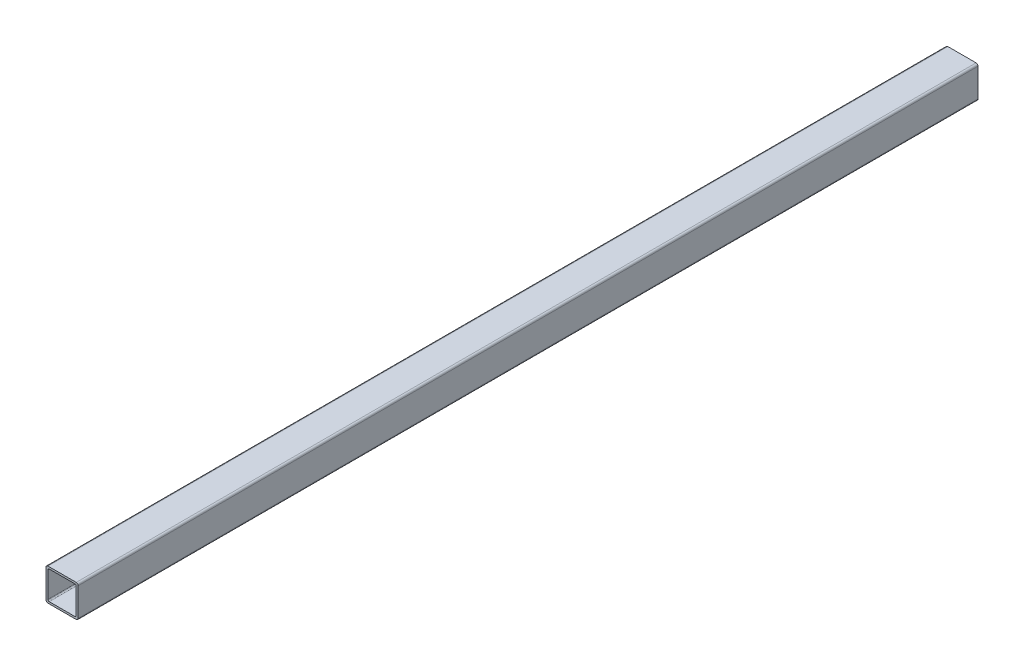
ISO-10303-21;
HEADER;
FILE_DESCRIPTION(('STEP AP214'),'2;1');
FILE_NAME('part.step','',(''),(''),'','','');
FILE_SCHEMA(('AUTOMOTIVE_DESIGN { 1 0 10303 214 1 1 1 1 }'));
ENDSEC;
DATA;
#1=APPLICATION_CONTEXT('core data for automotive mechanical design processes');
#2=APPLICATION_PROTOCOL_DEFINITION('international standard','automotive_design',2000,#1);
#3=PRODUCT_CONTEXT('',#1,'mechanical');
#4=PRODUCT('Part','Part','',(#3));
#5=PRODUCT_RELATED_PRODUCT_CATEGORY('part','',(#4));
#6=PRODUCT_DEFINITION_FORMATION('','',#4);
#7=PRODUCT_DEFINITION_CONTEXT('part definition',#1,'design');
#8=PRODUCT_DEFINITION('design','',#6,#7);
#9=PRODUCT_DEFINITION_SHAPE('','',#8);
#10=(LENGTH_UNIT() NAMED_UNIT(*) SI_UNIT(.MILLI.,.METRE.));
#11=(NAMED_UNIT(*) PLANE_ANGLE_UNIT() SI_UNIT($,.RADIAN.));
#12=(NAMED_UNIT(*) SI_UNIT($,.STERADIAN.) SOLID_ANGLE_UNIT());
#13=UNCERTAINTY_MEASURE_WITH_UNIT(LENGTH_MEASURE(1.E-05),#10,'distance_accuracy_value','');
#14=(GEOMETRIC_REPRESENTATION_CONTEXT(3) GLOBAL_UNCERTAINTY_ASSIGNED_CONTEXT((#13)) GLOBAL_UNIT_ASSIGNED_CONTEXT((#10,
#11,#12)) REPRESENTATION_CONTEXT('',''));
#15=CARTESIAN_POINT('',(0.,0.,0.));
#16=DIRECTION('',(0.,0.,1.));
#17=DIRECTION('',(1.,0.,0.));
#18=AXIS2_PLACEMENT_3D('',#15,#16,#17);
#19=CARTESIAN_POINT('',(0.,94.,2941.42135623731));
#20=DIRECTION('',(1.,0.,0.));
#21=DIRECTION('',(0.,0.,-1.));
#22=AXIS2_PLACEMENT_3D('',#19,#20,#21);
#23=PLANE('',#22);
#24=DIRECTION('',(0.,-1.,0.));
#25=VECTOR('',#24,1.);
#26=CARTESIAN_POINT('',(0.,94.,2800.));
#27=LINE('',#26,#25);
#28=CARTESIAN_POINT('',(0.,94.,2800.));
#29=VERTEX_POINT('',#28);
#30=CARTESIAN_POINT('',(0.,6.00000000000006,2800.));
#31=VERTEX_POINT('',#30);
#32=EDGE_CURVE('E306',#29,#31,#27,.T.);
#33=ORIENTED_EDGE('',*,*,#32,.F.);
#34=DIRECTION('',(0.,0.,-1.));
#35=VECTOR('',#34,1.);
#36=CARTESIAN_POINT('',(0.,94.,2941.42135623731));
#37=LINE('',#36,#35);
#38=CARTESIAN_POINT('',(0.,94.,0.));
#39=VERTEX_POINT('',#38);
#40=EDGE_CURVE('E50',#29,#39,#37,.T.);
#41=ORIENTED_EDGE('',*,*,#40,.T.);
#42=DIRECTION('',(0.,-1.,0.));
#43=VECTOR('',#42,1.);
#44=CARTESIAN_POINT('',(0.,94.,0.));
#45=LINE('',#44,#43);
#46=CARTESIAN_POINT('',(0.,6.00000000000006,0.));
#47=VERTEX_POINT('',#46);
#48=EDGE_CURVE('E201',#39,#47,#45,.T.);
#49=ORIENTED_EDGE('',*,*,#48,.T.);
#50=DIRECTION('',(0.,0.,-1.));
#51=VECTOR('',#50,1.);
#52=CARTESIAN_POINT('',(0.,6.00000000000006,2941.42135623731));
#53=LINE('',#52,#51);
#54=EDGE_CURVE('E204',#31,#47,#53,.T.);
#55=ORIENTED_EDGE('',*,*,#54,.F.);
#56=EDGE_LOOP('',(#33,#41,#49,#55));
#57=FACE_BOUND('',#56,.T.);
#58=ADVANCED_FACE('F35',(#57),#23,.F.);
#59=CARTESIAN_POINT('',(6.00000000000023,94.,2941.42135623731));
#60=DIRECTION('',(0.,0.,-1.));
#61=DIRECTION('',(-1.,0.,0.));
#62=AXIS2_PLACEMENT_3D('',#59,#60,#61);
#63=CYLINDRICAL_SURFACE('',#62,6.00000000000014);
#64=CARTESIAN_POINT('',(6.00000000000023,94.,2800.));
#65=DIRECTION('',(0.,0.,1.));
#66=DIRECTION('',(1.,0.,0.));
#67=AXIS2_PLACEMENT_3D('',#64,#65,#66);
#68=CIRCLE('',#67,6.00000000000014);
#69=CARTESIAN_POINT('',(6.00000000000023,100.,2800.));
#70=VERTEX_POINT('',#69);
#71=EDGE_CURVE('E242',#70,#29,#68,.T.);
#72=ORIENTED_EDGE('',*,*,#71,.F.);
#73=DIRECTION('',(0.,0.,-1.));
#74=VECTOR('',#73,1.);
#75=CARTESIAN_POINT('',(6.00000000000023,100.,2941.42135623731));
#76=LINE('',#75,#74);
#77=CARTESIAN_POINT('',(6.00000000000023,100.,0.));
#78=VERTEX_POINT('',#77);
#79=EDGE_CURVE('E207',#70,#78,#76,.T.);
#80=ORIENTED_EDGE('',*,*,#79,.T.);
#81=CARTESIAN_POINT('',(6.00000000000023,94.,0.));
#82=DIRECTION('',(0.,0.,1.));
#83=DIRECTION('',(1.,0.,0.));
#84=AXIS2_PLACEMENT_3D('',#81,#82,#83);
#85=CIRCLE('',#84,6.00000000000014);
#86=EDGE_CURVE('E199',#78,#39,#85,.T.);
#87=ORIENTED_EDGE('',*,*,#86,.T.);
#88=ORIENTED_EDGE('',*,*,#40,.F.);
#89=EDGE_LOOP('',(#72,#80,#87,#88));
#90=FACE_BOUND('',#89,.T.);
#91=ADVANCED_FACE('F239',(#90),#63,.T.);
#92=CARTESIAN_POINT('',(6.00000000000023,100.,2941.42135623731));
#93=DIRECTION('',(0.,-1.,0.));
#94=DIRECTION('',(0.,0.,-1.));
#95=AXIS2_PLACEMENT_3D('',#92,#93,#94);
#96=PLANE('',#95);
#97=DIRECTION('',(-1.,0.,0.));
#98=VECTOR('',#97,1.);
#99=CARTESIAN_POINT('',(6.00000000000023,100.,2800.));
#100=LINE('',#99,#98);
#101=CARTESIAN_POINT('',(93.9999999999994,100.,2800.));
#102=VERTEX_POINT('',#101);
#103=EDGE_CURVE('E247',#102,#70,#100,.T.);
#104=ORIENTED_EDGE('',*,*,#103,.F.);
#105=DIRECTION('',(0.,0.,-1.));
#106=VECTOR('',#105,1.);
#107=CARTESIAN_POINT('',(93.9999999999994,100.,2941.42135623731));
#108=LINE('',#107,#106);
#109=CARTESIAN_POINT('',(93.9999999999994,100.,0.));
#110=VERTEX_POINT('',#109);
#111=EDGE_CURVE('E209',#102,#110,#108,.T.);
#112=ORIENTED_EDGE('',*,*,#111,.T.);
#113=DIRECTION('',(-1.,0.,0.));
#114=VECTOR('',#113,1.);
#115=CARTESIAN_POINT('',(6.00000000000023,100.,0.));
#116=LINE('',#115,#114);
#117=EDGE_CURVE('E196',#110,#78,#116,.T.);
#118=ORIENTED_EDGE('',*,*,#117,.T.);
#119=ORIENTED_EDGE('',*,*,#79,.F.);
#120=EDGE_LOOP('',(#104,#112,#118,#119));
#121=FACE_BOUND('',#120,.T.);
#122=ADVANCED_FACE('F245',(#121),#96,.F.);
#123=CARTESIAN_POINT('',(93.9999999999994,94.,2941.42135623731));
#124=DIRECTION('',(0.,0.,-1.));
#125=DIRECTION('',(-1.,0.,0.));
#126=AXIS2_PLACEMENT_3D('',#123,#124,#125);
#127=CYLINDRICAL_SURFACE('',#126,6.00000000000014);
#128=CARTESIAN_POINT('',(93.9999999999994,94.,2800.));
#129=DIRECTION('',(0.,0.,1.));
#130=DIRECTION('',(1.,0.,0.));
#131=AXIS2_PLACEMENT_3D('',#128,#129,#130);
#132=CIRCLE('',#131,6.00000000000014);
#133=CARTESIAN_POINT('',(99.9999999999996,94.,2800.));
#134=VERTEX_POINT('',#133);
#135=EDGE_CURVE('E310',#134,#102,#132,.T.);
#136=ORIENTED_EDGE('',*,*,#135,.F.);
#137=DIRECTION('',(0.,0.,-1.));
#138=VECTOR('',#137,1.);
#139=CARTESIAN_POINT('',(99.9999999999996,94.,2941.42135623731));
#140=LINE('',#139,#138);
#141=CARTESIAN_POINT('',(99.9999999999996,94.,0.));
#142=VERTEX_POINT('',#141);
#143=EDGE_CURVE('E211',#134,#142,#140,.T.);
#144=ORIENTED_EDGE('',*,*,#143,.T.);
#145=CARTESIAN_POINT('',(93.9999999999994,94.,0.));
#146=DIRECTION('',(0.,0.,1.));
#147=DIRECTION('',(-1.,0.,0.));
#148=AXIS2_PLACEMENT_3D('',#145,#146,#147);
#149=CIRCLE('',#148,6.00000000000014);
#150=EDGE_CURVE('E193',#142,#110,#149,.T.);
#151=ORIENTED_EDGE('',*,*,#150,.T.);
#152=ORIENTED_EDGE('',*,*,#111,.F.);
#153=EDGE_LOOP('',(#136,#144,#151,#152));
#154=FACE_BOUND('',#153,.T.);
#155=ADVANCED_FACE('F250',(#154),#127,.T.);
#156=CARTESIAN_POINT('',(99.9999999999996,94.,2941.42135623731));
#157=DIRECTION('',(-1.,0.,0.));
#158=DIRECTION('',(0.,0.,1.));
#159=AXIS2_PLACEMENT_3D('',#156,#157,#158);
#160=PLANE('',#159);
#161=DIRECTION('',(0.,1.,0.));
#162=VECTOR('',#161,1.);
#163=CARTESIAN_POINT('',(99.9999999999996,94.,2800.));
#164=LINE('',#163,#162);
#165=CARTESIAN_POINT('',(99.9999999999996,6.00000000000006,2800.));
#166=VERTEX_POINT('',#165);
#167=EDGE_CURVE('E256',#166,#134,#164,.T.);
#168=ORIENTED_EDGE('',*,*,#167,.F.);
#169=DIRECTION('',(0.,0.,-1.));
#170=VECTOR('',#169,1.);
#171=CARTESIAN_POINT('',(99.9999999999996,6.00000000000006,2941.42135623731));
#172=LINE('',#171,#170);
#173=CARTESIAN_POINT('',(99.9999999999996,6.00000000000006,0.));
#174=VERTEX_POINT('',#173);
#175=EDGE_CURVE('E213',#166,#174,#172,.T.);
#176=ORIENTED_EDGE('',*,*,#175,.T.);
#177=DIRECTION('',(0.,1.,0.));
#178=VECTOR('',#177,1.);
#179=CARTESIAN_POINT('',(99.9999999999996,94.,0.));
#180=LINE('',#179,#178);
#181=EDGE_CURVE('E190',#174,#142,#180,.T.);
#182=ORIENTED_EDGE('',*,*,#181,.T.);
#183=ORIENTED_EDGE('',*,*,#143,.F.);
#184=EDGE_LOOP('',(#168,#176,#182,#183));
#185=FACE_BOUND('',#184,.T.);
#186=ADVANCED_FACE('F253',(#185),#160,.F.);
#187=CARTESIAN_POINT('',(93.9999999999994,6.00000000000006,2941.42135623731));
#188=DIRECTION('',(0.,0.,-1.));
#189=DIRECTION('',(-1.,0.,0.));
#190=AXIS2_PLACEMENT_3D('',#187,#188,#189);
#191=CYLINDRICAL_SURFACE('',#190,6.00000000000014);
#192=CARTESIAN_POINT('',(93.9999999999994,6.00000000000006,2800.));
#193=DIRECTION('',(0.,0.,1.));
#194=DIRECTION('',(1.,0.,0.));
#195=AXIS2_PLACEMENT_3D('',#192,#193,#194);
#196=CIRCLE('',#195,6.00000000000014);
#197=CARTESIAN_POINT('',(93.9999999999994,0.,2800.));
#198=VERTEX_POINT('',#197);
#199=EDGE_CURVE('E260',#198,#166,#196,.T.);
#200=ORIENTED_EDGE('',*,*,#199,.F.);
#201=DIRECTION('',(0.,0.,-1.));
#202=VECTOR('',#201,1.);
#203=CARTESIAN_POINT('',(93.9999999999994,0.,2941.42135623731));
#204=LINE('',#203,#202);
#205=CARTESIAN_POINT('',(93.9999999999994,0.,0.));
#206=VERTEX_POINT('',#205);
#207=EDGE_CURVE('E215',#198,#206,#204,.T.);
#208=ORIENTED_EDGE('',*,*,#207,.T.);
#209=CARTESIAN_POINT('',(93.9999999999994,6.00000000000006,0.));
#210=DIRECTION('',(0.,0.,1.));
#211=DIRECTION('',(1.,0.,0.));
#212=AXIS2_PLACEMENT_3D('',#209,#210,#211);
#213=CIRCLE('',#212,6.00000000000014);
#214=EDGE_CURVE('E187',#206,#174,#213,.T.);
#215=ORIENTED_EDGE('',*,*,#214,.T.);
#216=ORIENTED_EDGE('',*,*,#175,.F.);
#217=EDGE_LOOP('',(#200,#208,#215,#216));
#218=FACE_BOUND('',#217,.T.);
#219=ADVANCED_FACE('F259',(#218),#191,.T.);
#220=CARTESIAN_POINT('',(6.00000000000023,0.,2941.42135623731));
#221=DIRECTION('',(0.,1.,0.));
#222=DIRECTION('',(0.,0.,1.));
#223=AXIS2_PLACEMENT_3D('',#220,#221,#222);
#224=PLANE('',#223);
#225=DIRECTION('',(1.,0.,0.));
#226=VECTOR('',#225,1.);
#227=CARTESIAN_POINT('',(6.00000000000023,0.,2800.));
#228=LINE('',#227,#226);
#229=CARTESIAN_POINT('',(6.00000000000023,0.,2800.));
#230=VERTEX_POINT('',#229);
#231=EDGE_CURVE('E223',#230,#198,#228,.T.);
#232=ORIENTED_EDGE('',*,*,#231,.F.);
#233=DIRECTION('',(0.,0.,-1.));
#234=VECTOR('',#233,1.);
#235=CARTESIAN_POINT('',(6.00000000000023,0.,2941.42135623731));
#236=LINE('',#235,#234);
#237=CARTESIAN_POINT('',(6.00000000000023,0.,0.));
#238=VERTEX_POINT('',#237);
#239=EDGE_CURVE('E43',#230,#238,#236,.T.);
#240=ORIENTED_EDGE('',*,*,#239,.T.);
#241=DIRECTION('',(1.,0.,0.));
#242=VECTOR('',#241,1.);
#243=CARTESIAN_POINT('',(6.00000000000023,0.,0.));
#244=LINE('',#243,#242);
#245=EDGE_CURVE('E184',#238,#206,#244,.T.);
#246=ORIENTED_EDGE('',*,*,#245,.T.);
#247=ORIENTED_EDGE('',*,*,#207,.F.);
#248=EDGE_LOOP('',(#232,#240,#246,#247));
#249=FACE_BOUND('',#248,.T.);
#250=ADVANCED_FACE('F219',(#249),#224,.F.);
#251=CARTESIAN_POINT('',(6.00000000000023,6.00000000000006,2941.42135623731));
#252=DIRECTION('',(0.,0.,-1.));
#253=DIRECTION('',(-1.,0.,0.));
#254=AXIS2_PLACEMENT_3D('',#251,#252,#253);
#255=CYLINDRICAL_SURFACE('',#254,6.00000000000014);
#256=CARTESIAN_POINT('',(6.00000000000023,6.00000000000006,2800.));
#257=DIRECTION('',(0.,0.,1.));
#258=DIRECTION('',(1.,0.,0.));
#259=AXIS2_PLACEMENT_3D('',#256,#257,#258);
#260=CIRCLE('',#259,6.00000000000014);
#261=EDGE_CURVE('E233',#31,#230,#260,.T.);
#262=ORIENTED_EDGE('',*,*,#261,.F.);
#263=ORIENTED_EDGE('',*,*,#54,.T.);
#264=CARTESIAN_POINT('',(6.00000000000023,6.00000000000006,0.));
#265=DIRECTION('',(0.,0.,1.));
#266=DIRECTION('',(1.,0.,0.));
#267=AXIS2_PLACEMENT_3D('',#264,#265,#266);
#268=CIRCLE('',#267,6.00000000000014);
#269=EDGE_CURVE('E181',#47,#238,#268,.T.);
#270=ORIENTED_EDGE('',*,*,#269,.T.);
#271=ORIENTED_EDGE('',*,*,#239,.F.);
#272=EDGE_LOOP('',(#262,#263,#270,#271));
#273=FACE_BOUND('',#272,.T.);
#274=ADVANCED_FACE('F37',(#273),#255,.T.);
#275=CARTESIAN_POINT('',(6.00000000000023,6.00000000000006,0.));
#276=DIRECTION('',(0.,0.,1.));
#277=DIRECTION('',(1.,0.,0.));
#278=AXIS2_PLACEMENT_3D('',#275,#276,#277);
#279=PLANE('',#278);
#280=ORIENTED_EDGE('',*,*,#269,.F.);
#281=ORIENTED_EDGE('',*,*,#48,.F.);
#282=ORIENTED_EDGE('',*,*,#86,.F.);
#283=ORIENTED_EDGE('',*,*,#117,.F.);
#284=ORIENTED_EDGE('',*,*,#150,.F.);
#285=ORIENTED_EDGE('',*,*,#181,.F.);
#286=ORIENTED_EDGE('',*,*,#214,.F.);
#287=ORIENTED_EDGE('',*,*,#245,.F.);
#288=EDGE_LOOP('',(#280,#281,#282,#283,#284,#285,#286,#287));
#289=FACE_BOUND('',#288,.T.);
#290=CARTESIAN_POINT('',(9.9999999999989,10.0000000000001,0.));
#291=DIRECTION('',(0.,0.,1.));
#292=DIRECTION('',(1.,0.,0.));
#293=AXIS2_PLACEMENT_3D('',#290,#291,#292);
#294=CIRCLE('',#293,3.99999999999978);
#295=CARTESIAN_POINT('',(5.99999999999934,10.0000000000001,0.));
#296=VERTEX_POINT('',#295);
#297=CARTESIAN_POINT('',(9.9999999999989,6.00000000000006,0.));
#298=VERTEX_POINT('',#297);
#299=EDGE_CURVE('E262',#296,#298,#294,.T.);
#300=ORIENTED_EDGE('',*,*,#299,.T.);
#301=DIRECTION('',(1.,0.,0.));
#302=VECTOR('',#301,1.);
#303=CARTESIAN_POINT('',(9.9999999999989,6.00000000000006,0.));
#304=LINE('',#303,#302);
#305=CARTESIAN_POINT('',(90.0000000000007,6.00000000000028,0.));
#306=VERTEX_POINT('',#305);
#307=EDGE_CURVE('E269',#298,#306,#304,.T.);
#308=ORIENTED_EDGE('',*,*,#307,.T.);
#309=CARTESIAN_POINT('',(90.0000000000007,10.0000000000001,0.));
#310=DIRECTION('',(0.,0.,1.));
#311=DIRECTION('',(1.,0.,0.));
#312=AXIS2_PLACEMENT_3D('',#309,#310,#311);
#313=CIRCLE('',#312,3.99999999999978);
#314=CARTESIAN_POINT('',(94.0000000000003,10.0000000000001,0.));
#315=VERTEX_POINT('',#314);
#316=EDGE_CURVE('E272',#306,#315,#313,.T.);
#317=ORIENTED_EDGE('',*,*,#316,.T.);
#318=DIRECTION('',(0.,1.,0.));
#319=VECTOR('',#318,1.);
#320=CARTESIAN_POINT('',(94.0000000000003,90.,0.));
#321=LINE('',#320,#319);
#322=CARTESIAN_POINT('',(94.0000000000005,90.,0.));
#323=VERTEX_POINT('',#322);
#324=EDGE_CURVE('E275',#315,#323,#321,.T.);
#325=ORIENTED_EDGE('',*,*,#324,.T.);
#326=CARTESIAN_POINT('',(90.0000000000007,90.,0.));
#327=DIRECTION('',(0.,0.,1.));
#328=DIRECTION('',(-1.,0.,0.));
#329=AXIS2_PLACEMENT_3D('',#326,#327,#328);
#330=CIRCLE('',#329,3.99999999999978);
#331=CARTESIAN_POINT('',(90.0000000000007,94.,0.));
#332=VERTEX_POINT('',#331);
#333=EDGE_CURVE('E278',#323,#332,#330,.T.);
#334=ORIENTED_EDGE('',*,*,#333,.T.);
#335=DIRECTION('',(-1.,0.,0.));
#336=VECTOR('',#335,1.);
#337=CARTESIAN_POINT('',(9.9999999999989,94.,0.));
#338=LINE('',#337,#336);
#339=CARTESIAN_POINT('',(9.9999999999989,93.9999999999998,0.));
#340=VERTEX_POINT('',#339);
#341=EDGE_CURVE('E281',#332,#340,#338,.T.);
#342=ORIENTED_EDGE('',*,*,#341,.T.);
#343=CARTESIAN_POINT('',(9.9999999999989,90.,0.));
#344=DIRECTION('',(0.,0.,1.));
#345=DIRECTION('',(1.,0.,0.));
#346=AXIS2_PLACEMENT_3D('',#343,#344,#345);
#347=CIRCLE('',#346,3.99999999999978);
#348=CARTESIAN_POINT('',(5.99999999999934,90.,0.));
#349=VERTEX_POINT('',#348);
#350=EDGE_CURVE('E284',#340,#349,#347,.T.);
#351=ORIENTED_EDGE('',*,*,#350,.T.);
#352=DIRECTION('',(0.,-1.,0.));
#353=VECTOR('',#352,1.);
#354=CARTESIAN_POINT('',(5.99999999999934,90.,0.));
#355=LINE('',#354,#353);
#356=EDGE_CURVE('E163',#349,#296,#355,.T.);
#357=ORIENTED_EDGE('',*,*,#356,.T.);
#358=EDGE_LOOP('',(#300,#308,#317,#325,#334,#342,#351,#357));
#359=FACE_BOUND('',#358,.T.);
#360=ADVANCED_FACE('F229',(#289,#359),#279,.F.);
#361=CARTESIAN_POINT('',(5.99999999999934,90.,2941.42135623731));
#362=DIRECTION('',(1.,0.,0.));
#363=DIRECTION('',(0.,0.,-1.));
#364=AXIS2_PLACEMENT_3D('',#361,#362,#363);
#365=PLANE('',#364);
#366=DIRECTION('',(0.,0.,-1.));
#367=VECTOR('',#366,1.);
#368=CARTESIAN_POINT('',(5.99999999999934,90.,2941.42135623731));
#369=LINE('',#368,#367);
#370=CARTESIAN_POINT('',(5.99999999999934,90.,2800.));
#371=VERTEX_POINT('',#370);
#372=EDGE_CURVE('E155',#371,#349,#369,.T.);
#373=ORIENTED_EDGE('',*,*,#372,.F.);
#374=DIRECTION('',(0.,-1.,0.));
#375=VECTOR('',#374,1.);
#376=CARTESIAN_POINT('',(5.99999999999934,90.,2800.));
#377=LINE('',#376,#375);
#378=CARTESIAN_POINT('',(5.99999999999934,10.0000000000001,2800.));
#379=VERTEX_POINT('',#378);
#380=EDGE_CURVE('E11',#371,#379,#377,.T.);
#381=ORIENTED_EDGE('',*,*,#380,.T.);
#382=DIRECTION('',(0.,0.,-1.));
#383=VECTOR('',#382,1.);
#384=CARTESIAN_POINT('',(5.99999999999934,10.0000000000001,2941.42135623731));
#385=LINE('',#384,#383);
#386=EDGE_CURVE('E165',#379,#296,#385,.T.);
#387=ORIENTED_EDGE('',*,*,#386,.T.);
#388=ORIENTED_EDGE('',*,*,#356,.F.);
#389=EDGE_LOOP('',(#373,#381,#387,#388));
#390=FACE_BOUND('',#389,.T.);
#391=ADVANCED_FACE('F161',(#390),#365,.T.);
#392=CARTESIAN_POINT('',(9.9999999999989,90.,2941.42135623731));
#393=DIRECTION('',(0.,0.,-1.));
#394=DIRECTION('',(-1.,0.,0.));
#395=AXIS2_PLACEMENT_3D('',#392,#393,#394);
#396=CYLINDRICAL_SURFACE('',#395,3.99999999999978);
#397=DIRECTION('',(0.,0.,-1.));
#398=VECTOR('',#397,1.);
#399=CARTESIAN_POINT('',(9.9999999999989,93.9999999999998,2941.42135623731));
#400=LINE('',#399,#398);
#401=CARTESIAN_POINT('',(9.9999999999989,93.9999999999998,2800.));
#402=VERTEX_POINT('',#401);
#403=EDGE_CURVE('E157',#402,#340,#400,.T.);
#404=ORIENTED_EDGE('',*,*,#403,.F.);
#405=CARTESIAN_POINT('',(9.9999999999989,90.,2800.));
#406=DIRECTION('',(0.,0.,1.));
#407=DIRECTION('',(1.,0.,0.));
#408=AXIS2_PLACEMENT_3D('',#405,#406,#407);
#409=CIRCLE('',#408,3.99999999999978);
#410=EDGE_CURVE('E148',#402,#371,#409,.T.);
#411=ORIENTED_EDGE('',*,*,#410,.T.);
#412=ORIENTED_EDGE('',*,*,#372,.T.);
#413=ORIENTED_EDGE('',*,*,#350,.F.);
#414=EDGE_LOOP('',(#404,#411,#412,#413));
#415=FACE_BOUND('',#414,.T.);
#416=ADVANCED_FACE('F153',(#415),#396,.F.);
#417=CARTESIAN_POINT('',(9.9999999999989,94.,2941.42135623731));
#418=DIRECTION('',(0.,-1.,0.));
#419=DIRECTION('',(0.,0.,-1.));
#420=AXIS2_PLACEMENT_3D('',#417,#418,#419);
#421=PLANE('',#420);
#422=DIRECTION('',(0.,0.,-1.));
#423=VECTOR('',#422,1.);
#424=CARTESIAN_POINT('',(90.0000000000007,94.,2941.42135623731));
#425=LINE('',#424,#423);
#426=CARTESIAN_POINT('',(90.0000000000007,94.,2800.));
#427=VERTEX_POINT('',#426);
#428=EDGE_CURVE('E167',#427,#332,#425,.T.);
#429=ORIENTED_EDGE('',*,*,#428,.F.);
#430=DIRECTION('',(-1.,0.,0.));
#431=VECTOR('',#430,1.);
#432=CARTESIAN_POINT('',(9.9999999999989,94.,2800.));
#433=LINE('',#432,#431);
#434=EDGE_CURVE('E159',#427,#402,#433,.T.);
#435=ORIENTED_EDGE('',*,*,#434,.T.);
#436=ORIENTED_EDGE('',*,*,#403,.T.);
#437=ORIENTED_EDGE('',*,*,#341,.F.);
#438=EDGE_LOOP('',(#429,#435,#436,#437));
#439=FACE_BOUND('',#438,.T.);
#440=ADVANCED_FACE('F290',(#439),#421,.T.);
#441=CARTESIAN_POINT('',(90.0000000000007,90.,2941.42135623731));
#442=DIRECTION('',(0.,0.,-1.));
#443=DIRECTION('',(-1.,0.,0.));
#444=AXIS2_PLACEMENT_3D('',#441,#442,#443);
#445=CYLINDRICAL_SURFACE('',#444,3.99999999999978);
#446=DIRECTION('',(0.,0.,-1.));
#447=VECTOR('',#446,1.);
#448=CARTESIAN_POINT('',(94.0000000000005,90.,2941.42135623731));
#449=LINE('',#448,#447);
#450=CARTESIAN_POINT('',(94.0000000000005,90.,2800.));
#451=VERTEX_POINT('',#450);
#452=EDGE_CURVE('E173',#451,#323,#449,.T.);
#453=ORIENTED_EDGE('',*,*,#452,.F.);
#454=CARTESIAN_POINT('',(90.0000000000007,90.,2800.));
#455=DIRECTION('',(0.,0.,1.));
#456=DIRECTION('',(1.,0.,0.));
#457=AXIS2_PLACEMENT_3D('',#454,#455,#456);
#458=CIRCLE('',#457,3.99999999999978);
#459=EDGE_CURVE('E292',#451,#427,#458,.T.);
#460=ORIENTED_EDGE('',*,*,#459,.T.);
#461=ORIENTED_EDGE('',*,*,#428,.T.);
#462=ORIENTED_EDGE('',*,*,#333,.F.);
#463=EDGE_LOOP('',(#453,#460,#461,#462));
#464=FACE_BOUND('',#463,.T.);
#465=ADVANCED_FACE('F327',(#464),#445,.F.);
#466=CARTESIAN_POINT('',(94.0000000000003,90.,2941.42135623731));
#467=DIRECTION('',(-1.,0.,0.));
#468=DIRECTION('',(0.,0.,1.));
#469=AXIS2_PLACEMENT_3D('',#466,#467,#468);
#470=PLANE('',#469);
#471=DIRECTION('',(0.,0.,-1.));
#472=VECTOR('',#471,1.);
#473=CARTESIAN_POINT('',(94.0000000000003,10.0000000000001,2941.42135623731));
#474=LINE('',#473,#472);
#475=CARTESIAN_POINT('',(94.0000000000003,10.0000000000001,2800.));
#476=VERTEX_POINT('',#475);
#477=EDGE_CURVE('E175',#476,#315,#474,.T.);
#478=ORIENTED_EDGE('',*,*,#477,.F.);
#479=DIRECTION('',(0.,1.,0.));
#480=VECTOR('',#479,1.);
#481=CARTESIAN_POINT('',(94.0000000000003,90.,2800.));
#482=LINE('',#481,#480);
#483=EDGE_CURVE('E294',#476,#451,#482,.T.);
#484=ORIENTED_EDGE('',*,*,#483,.T.);
#485=ORIENTED_EDGE('',*,*,#452,.T.);
#486=ORIENTED_EDGE('',*,*,#324,.F.);
#487=EDGE_LOOP('',(#478,#484,#485,#486));
#488=FACE_BOUND('',#487,.T.);
#489=ADVANCED_FACE('F324',(#488),#470,.T.);
#490=CARTESIAN_POINT('',(90.0000000000007,10.0000000000001,2941.42135623731));
#491=DIRECTION('',(0.,0.,-1.));
#492=DIRECTION('',(-1.,0.,0.));
#493=AXIS2_PLACEMENT_3D('',#490,#491,#492);
#494=CYLINDRICAL_SURFACE('',#493,3.99999999999978);
#495=DIRECTION('',(0.,0.,-1.));
#496=VECTOR('',#495,1.);
#497=CARTESIAN_POINT('',(90.0000000000007,6.00000000000028,2941.42135623731));
#498=LINE('',#497,#496);
#499=CARTESIAN_POINT('',(90.0000000000007,6.00000000000028,2800.));
#500=VERTEX_POINT('',#499);
#501=EDGE_CURVE('E177',#500,#306,#498,.T.);
#502=ORIENTED_EDGE('',*,*,#501,.F.);
#503=CARTESIAN_POINT('',(90.0000000000007,10.0000000000001,2800.));
#504=DIRECTION('',(0.,0.,1.));
#505=DIRECTION('',(1.,0.,0.));
#506=AXIS2_PLACEMENT_3D('',#503,#504,#505);
#507=CIRCLE('',#506,3.99999999999978);
#508=EDGE_CURVE('E299',#500,#476,#507,.T.);
#509=ORIENTED_EDGE('',*,*,#508,.T.);
#510=ORIENTED_EDGE('',*,*,#477,.T.);
#511=ORIENTED_EDGE('',*,*,#316,.F.);
#512=EDGE_LOOP('',(#502,#509,#510,#511));
#513=FACE_BOUND('',#512,.T.);
#514=ADVANCED_FACE('F321',(#513),#494,.F.);
#515=CARTESIAN_POINT('',(9.9999999999989,6.00000000000006,2941.42135623731));
#516=DIRECTION('',(0.,1.,0.));
#517=DIRECTION('',(0.,0.,1.));
#518=AXIS2_PLACEMENT_3D('',#515,#516,#517);
#519=PLANE('',#518);
#520=DIRECTION('',(0.,0.,-1.));
#521=VECTOR('',#520,1.);
#522=CARTESIAN_POINT('',(9.9999999999989,6.00000000000006,2941.42135623731));
#523=LINE('',#522,#521);
#524=CARTESIAN_POINT('',(9.9999999999989,6.00000000000006,2800.));
#525=VERTEX_POINT('',#524);
#526=EDGE_CURVE('E179',#525,#298,#523,.T.);
#527=ORIENTED_EDGE('',*,*,#526,.F.);
#528=DIRECTION('',(1.,0.,0.));
#529=VECTOR('',#528,1.);
#530=CARTESIAN_POINT('',(9.9999999999989,6.00000000000006,2800.));
#531=LINE('',#530,#529);
#532=EDGE_CURVE('E302',#525,#500,#531,.T.);
#533=ORIENTED_EDGE('',*,*,#532,.T.);
#534=ORIENTED_EDGE('',*,*,#501,.T.);
#535=ORIENTED_EDGE('',*,*,#307,.F.);
#536=EDGE_LOOP('',(#527,#533,#534,#535));
#537=FACE_BOUND('',#536,.T.);
#538=ADVANCED_FACE('F316',(#537),#519,.T.);
#539=CARTESIAN_POINT('',(9.9999999999989,10.0000000000001,2941.42135623731));
#540=DIRECTION('',(0.,0.,-1.));
#541=DIRECTION('',(-1.,0.,0.));
#542=AXIS2_PLACEMENT_3D('',#539,#540,#541);
#543=CYLINDRICAL_SURFACE('',#542,3.99999999999978);
#544=ORIENTED_EDGE('',*,*,#386,.F.);
#545=CARTESIAN_POINT('',(9.9999999999989,10.0000000000001,2800.));
#546=DIRECTION('',(0.,0.,1.));
#547=DIRECTION('',(1.,0.,0.));
#548=AXIS2_PLACEMENT_3D('',#545,#546,#547);
#549=CIRCLE('',#548,3.99999999999978);
#550=EDGE_CURVE('E58',#379,#525,#549,.T.);
#551=ORIENTED_EDGE('',*,*,#550,.T.);
#552=ORIENTED_EDGE('',*,*,#526,.T.);
#553=ORIENTED_EDGE('',*,*,#299,.F.);
#554=EDGE_LOOP('',(#544,#551,#552,#553));
#555=FACE_BOUND('',#554,.T.);
#556=ADVANCED_FACE('F312',(#555),#543,.F.);
#557=CARTESIAN_POINT('',(6.00000000000023,100.000000000001,2800.));
#558=DIRECTION('',(0.,0.,1.));
#559=DIRECTION('',(1.,0.,0.));
#560=AXIS2_PLACEMENT_3D('',#557,#558,#559);
#561=PLANE('',#560);
#562=ORIENTED_EDGE('',*,*,#550,.F.);
#563=ORIENTED_EDGE('',*,*,#380,.F.);
#564=ORIENTED_EDGE('',*,*,#410,.F.);
#565=ORIENTED_EDGE('',*,*,#434,.F.);
#566=ORIENTED_EDGE('',*,*,#459,.F.);
#567=ORIENTED_EDGE('',*,*,#483,.F.);
#568=ORIENTED_EDGE('',*,*,#508,.F.);
#569=ORIENTED_EDGE('',*,*,#532,.F.);
#570=EDGE_LOOP('',(#562,#563,#564,#565,#566,#567,#568,#569));
#571=FACE_BOUND('',#570,.T.);
#572=ORIENTED_EDGE('',*,*,#32,.T.);
#573=ORIENTED_EDGE('',*,*,#261,.T.);
#574=ORIENTED_EDGE('',*,*,#231,.T.);
#575=ORIENTED_EDGE('',*,*,#199,.T.);
#576=ORIENTED_EDGE('',*,*,#167,.T.);
#577=ORIENTED_EDGE('',*,*,#135,.T.);
#578=ORIENTED_EDGE('',*,*,#103,.T.);
#579=ORIENTED_EDGE('',*,*,#71,.T.);
#580=EDGE_LOOP('',(#572,#573,#574,#575,#576,#577,#578,#579));
#581=FACE_BOUND('',#580,.T.);
#582=ADVANCED_FACE('F146',(#571,#581),#561,.T.);
#583=CLOSED_SHELL('',(#58,#91,#122,#155,#186,#219,#250,#274,#360,#391,#416,#440,#465,#489,#514,
#538,#556,#582));
#584=MANIFOLD_SOLID_BREP('B2',#583);
#585=ADVANCED_BREP_SHAPE_REPRESENTATION('',(#18,#584),#14);
#586=SHAPE_DEFINITION_REPRESENTATION(#9,#585);
ENDSEC;
END-ISO-10303-21;
